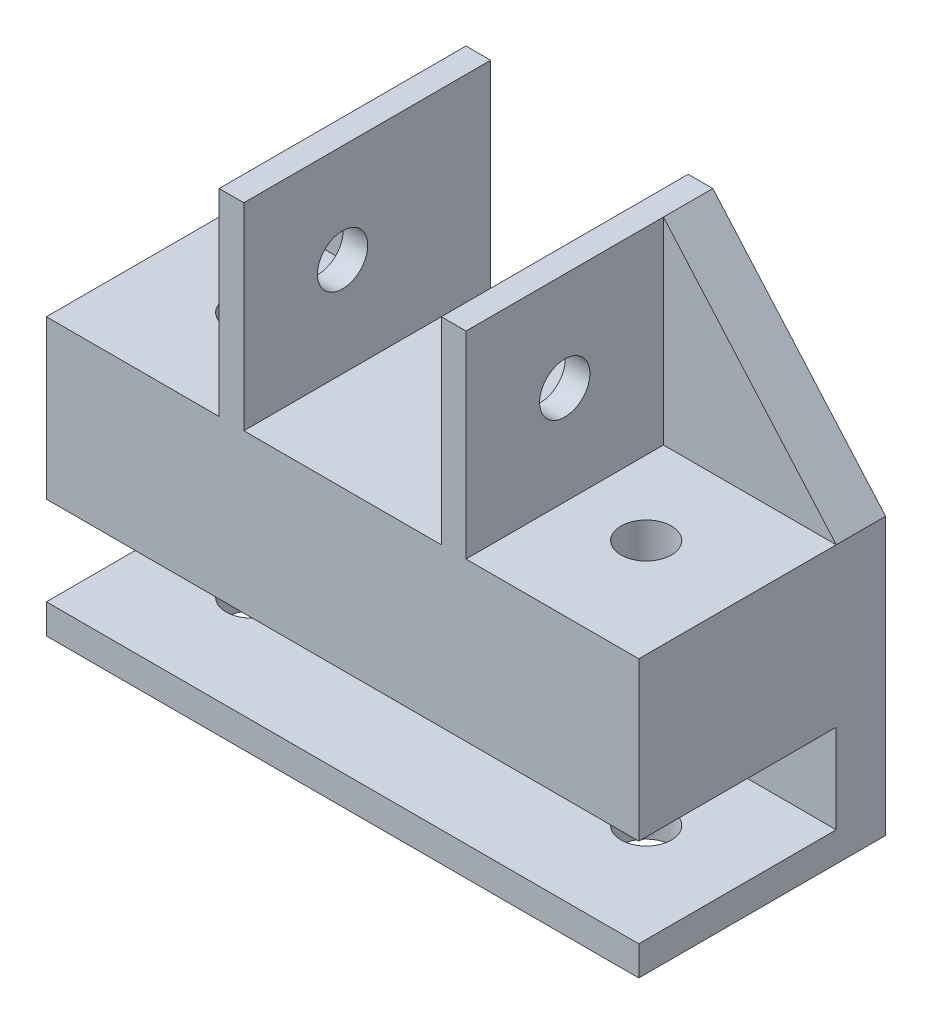
ISO-10303-21;
HEADER;
FILE_DESCRIPTION(('STEP AP214'),'2;1');
FILE_NAME('part.step','',(''),(''),'','','');
FILE_SCHEMA(('AUTOMOTIVE_DESIGN { 1 0 10303 214 1 1 1 1 }'));
ENDSEC;
DATA;
#1=APPLICATION_CONTEXT('core data for automotive mechanical design processes');
#2=APPLICATION_PROTOCOL_DEFINITION('international standard','automotive_design',2000,#1);
#3=PRODUCT_CONTEXT('',#1,'mechanical');
#4=PRODUCT('Part','Part','',(#3));
#5=PRODUCT_RELATED_PRODUCT_CATEGORY('part','',(#4));
#6=PRODUCT_DEFINITION_FORMATION('','',#4);
#7=PRODUCT_DEFINITION_CONTEXT('part definition',#1,'design');
#8=PRODUCT_DEFINITION('design','',#6,#7);
#9=PRODUCT_DEFINITION_SHAPE('','',#8);
#10=(LENGTH_UNIT() NAMED_UNIT(*) SI_UNIT(.MILLI.,.METRE.));
#11=(NAMED_UNIT(*) PLANE_ANGLE_UNIT() SI_UNIT($,.RADIAN.));
#12=(NAMED_UNIT(*) SI_UNIT($,.STERADIAN.) SOLID_ANGLE_UNIT());
#13=UNCERTAINTY_MEASURE_WITH_UNIT(LENGTH_MEASURE(1.E-05),#10,'distance_accuracy_value','');
#14=(GEOMETRIC_REPRESENTATION_CONTEXT(3) GLOBAL_UNCERTAINTY_ASSIGNED_CONTEXT((#13)) GLOBAL_UNIT_ASSIGNED_CONTEXT((#10,
#11,#12)) REPRESENTATION_CONTEXT('',''));
#15=CARTESIAN_POINT('',(0.,0.,0.));
#16=DIRECTION('',(0.,0.,1.));
#17=DIRECTION('',(1.,0.,0.));
#18=AXIS2_PLACEMENT_3D('',#15,#16,#17);
#19=CARTESIAN_POINT('',(0.,0.,-25.));
#20=DIRECTION('',(0.752576694706878,-0.658504607868518,0.));
#21=DIRECTION('',(0.658504607868518,0.752576694706878,0.));
#22=AXIS2_PLACEMENT_3D('',#19,#20,#21);
#23=PLANE('',#22);
#24=DIRECTION('',(-0.658504607868518,-0.752576694706878,0.));
#25=VECTOR('',#24,1.);
#26=CARTESIAN_POINT('',(0.,0.,-20.));
#27=LINE('',#26,#25);
#28=CARTESIAN_POINT('',(17.5,20.,-20.));
#29=VERTEX_POINT('',#28);
#30=CARTESIAN_POINT('',(0.,0.,-20.));
#31=VERTEX_POINT('',#30);
#32=EDGE_CURVE('E11',#29,#31,#27,.T.);
#33=ORIENTED_EDGE('',*,*,#32,.F.);
#34=DIRECTION('',(0.,0.,1.));
#35=VECTOR('',#34,1.);
#36=CARTESIAN_POINT('',(17.5,20.,-25.));
#37=LINE('',#36,#35);
#38=CARTESIAN_POINT('',(17.5,20.,-25.));
#39=VERTEX_POINT('',#38);
#40=EDGE_CURVE('E228',#39,#29,#37,.T.);
#41=ORIENTED_EDGE('',*,*,#40,.F.);
#42=DIRECTION('',(0.658504607868518,0.752576694706878,0.));
#43=VECTOR('',#42,1.);
#44=CARTESIAN_POINT('',(0.,0.,-25.));
#45=LINE('',#44,#43);
#46=CARTESIAN_POINT('',(0.,0.,-25.));
#47=VERTEX_POINT('',#46);
#48=EDGE_CURVE('E223',#47,#39,#45,.T.);
#49=ORIENTED_EDGE('',*,*,#48,.F.);
#50=DIRECTION('',(0.,0.,1.));
#51=VECTOR('',#50,1.);
#52=CARTESIAN_POINT('',(0.,0.,-25.));
#53=LINE('',#52,#51);
#54=EDGE_CURVE('E226',#47,#31,#53,.T.);
#55=ORIENTED_EDGE('',*,*,#54,.T.);
#56=EDGE_LOOP('',(#33,#41,#49,#55));
#57=FACE_BOUND('',#56,.T.);
#58=ADVANCED_FACE('F34',(#57),#23,.F.);
#59=CARTESIAN_POINT('',(0.,20.,0.));
#60=DIRECTION('',(0.,0.,-1.));
#61=DIRECTION('',(-1.,0.,0.));
#62=AXIS2_PLACEMENT_3D('',#59,#60,#61);
#63=PLANE('',#62);
#64=DIRECTION('',(0.,-1.,0.));
#65=VECTOR('',#64,1.);
#66=CARTESIAN_POINT('',(17.5,0.,0.));
#67=LINE('',#66,#65);
#68=CARTESIAN_POINT('',(17.5,20.,0.));
#69=VERTEX_POINT('',#68);
#70=CARTESIAN_POINT('',(17.5,0.,0.));
#71=VERTEX_POINT('',#70);
#72=EDGE_CURVE('E173',#69,#71,#67,.T.);
#73=ORIENTED_EDGE('',*,*,#72,.T.);
#74=DIRECTION('',(-1.,0.,0.));
#75=VECTOR('',#74,1.);
#76=CARTESIAN_POINT('',(17.5,0.,0.));
#77=LINE('',#76,#75);
#78=CARTESIAN_POINT('',(0.,0.,0.));
#79=VERTEX_POINT('',#78);
#80=EDGE_CURVE('E158',#71,#79,#77,.T.);
#81=ORIENTED_EDGE('',*,*,#80,.T.);
#82=DIRECTION('',(0.,-1.,0.));
#83=VECTOR('',#82,1.);
#84=CARTESIAN_POINT('',(0.,20.,0.));
#85=LINE('',#84,#83);
#86=CARTESIAN_POINT('',(0.,-16.,0.));
#87=VERTEX_POINT('',#86);
#88=EDGE_CURVE('E313',#79,#87,#85,.T.);
#89=ORIENTED_EDGE('',*,*,#88,.T.);
#90=DIRECTION('',(-1.,0.,0.));
#91=VECTOR('',#90,1.);
#92=CARTESIAN_POINT('',(0.,-16.,0.));
#93=LINE('',#92,#91);
#94=CARTESIAN_POINT('',(60.,-16.,0.));
#95=VERTEX_POINT('',#94);
#96=EDGE_CURVE('E243',#95,#87,#93,.T.);
#97=ORIENTED_EDGE('',*,*,#96,.F.);
#98=DIRECTION('',(0.,1.,0.));
#99=VECTOR('',#98,1.);
#100=CARTESIAN_POINT('',(60.,-28.,0.));
#101=LINE('',#100,#99);
#102=CARTESIAN_POINT('',(60.,0.,0.));
#103=VERTEX_POINT('',#102);
#104=EDGE_CURVE('E293',#95,#103,#101,.T.);
#105=ORIENTED_EDGE('',*,*,#104,.T.);
#106=DIRECTION('',(1.,0.,0.));
#107=VECTOR('',#106,1.);
#108=CARTESIAN_POINT('',(42.5,0.,0.));
#109=LINE('',#108,#107);
#110=CARTESIAN_POINT('',(42.5,0.,0.));
#111=VERTEX_POINT('',#110);
#112=EDGE_CURVE('E220',#111,#103,#109,.T.);
#113=ORIENTED_EDGE('',*,*,#112,.F.);
#114=DIRECTION('',(0.,-1.,0.));
#115=VECTOR('',#114,1.);
#116=CARTESIAN_POINT('',(42.5,0.,0.));
#117=LINE('',#116,#115);
#118=CARTESIAN_POINT('',(42.5,20.,0.));
#119=VERTEX_POINT('',#118);
#120=EDGE_CURVE('E214',#119,#111,#117,.T.);
#121=ORIENTED_EDGE('',*,*,#120,.F.);
#122=DIRECTION('',(1.,0.,0.));
#123=VECTOR('',#122,1.);
#124=CARTESIAN_POINT('',(0.,20.,0.));
#125=LINE('',#124,#123);
#126=CARTESIAN_POINT('',(40.,20.,0.));
#127=VERTEX_POINT('',#126);
#128=EDGE_CURVE('E264',#127,#119,#125,.T.);
#129=ORIENTED_EDGE('',*,*,#128,.F.);
#130=DIRECTION('',(0.,-1.,0.));
#131=VECTOR('',#130,1.);
#132=CARTESIAN_POINT('',(40.,20.,0.));
#133=LINE('',#132,#131);
#134=CARTESIAN_POINT('',(40.,0.,0.));
#135=VERTEX_POINT('',#134);
#136=EDGE_CURVE('E273',#127,#135,#133,.T.);
#137=ORIENTED_EDGE('',*,*,#136,.T.);
#138=DIRECTION('',(1.,0.,0.));
#139=VECTOR('',#138,1.);
#140=CARTESIAN_POINT('',(0.,0.,0.));
#141=LINE('',#140,#139);
#142=CARTESIAN_POINT('',(20.,0.,0.));
#143=VERTEX_POINT('',#142);
#144=EDGE_CURVE('E284',#143,#135,#141,.T.);
#145=ORIENTED_EDGE('',*,*,#144,.F.);
#146=DIRECTION('',(0.,-1.,0.));
#147=VECTOR('',#146,1.);
#148=CARTESIAN_POINT('',(20.,20.,0.));
#149=LINE('',#148,#147);
#150=CARTESIAN_POINT('',(20.,20.,0.));
#151=VERTEX_POINT('',#150);
#152=EDGE_CURVE('E320',#151,#143,#149,.T.);
#153=ORIENTED_EDGE('',*,*,#152,.F.);
#154=DIRECTION('',(1.,0.,0.));
#155=VECTOR('',#154,1.);
#156=CARTESIAN_POINT('',(0.,20.,0.));
#157=LINE('',#156,#155);
#158=EDGE_CURVE('E179',#69,#151,#157,.T.);
#159=ORIENTED_EDGE('',*,*,#158,.F.);
#160=EDGE_LOOP('',(#73,#81,#89,#97,#105,#113,#121,#129,#137,#145,#153,#159));
#161=FACE_BOUND('',#160,.T.);
#162=ADVANCED_FACE('F177',(#161),#63,.F.);
#163=CARTESIAN_POINT('',(0.,20.,-25.));
#164=DIRECTION('',(0.,0.,-1.));
#165=DIRECTION('',(-1.,0.,0.));
#166=AXIS2_PLACEMENT_3D('',#163,#164,#165);
#167=PLANE('',#166);
#168=ORIENTED_EDGE('',*,*,#48,.T.);
#169=DIRECTION('',(1.,0.,0.));
#170=VECTOR('',#169,1.);
#171=CARTESIAN_POINT('',(0.,20.,-25.));
#172=LINE('',#171,#170);
#173=CARTESIAN_POINT('',(20.,20.,-25.));
#174=VERTEX_POINT('',#173);
#175=EDGE_CURVE('E308',#39,#174,#172,.T.);
#176=ORIENTED_EDGE('',*,*,#175,.T.);
#177=DIRECTION('',(0.,-1.,0.));
#178=VECTOR('',#177,1.);
#179=CARTESIAN_POINT('',(20.,20.,-25.));
#180=LINE('',#179,#178);
#181=CARTESIAN_POINT('',(20.,0.,-25.));
#182=VERTEX_POINT('',#181);
#183=EDGE_CURVE('E317',#174,#182,#180,.T.);
#184=ORIENTED_EDGE('',*,*,#183,.T.);
#185=DIRECTION('',(1.,0.,0.));
#186=VECTOR('',#185,1.);
#187=CARTESIAN_POINT('',(0.,0.,-25.));
#188=LINE('',#187,#186);
#189=CARTESIAN_POINT('',(40.,0.,-25.));
#190=VERTEX_POINT('',#189);
#191=EDGE_CURVE('E280',#182,#190,#188,.T.);
#192=ORIENTED_EDGE('',*,*,#191,.T.);
#193=DIRECTION('',(0.,-1.,0.));
#194=VECTOR('',#193,1.);
#195=CARTESIAN_POINT('',(40.,20.,-25.));
#196=LINE('',#195,#194);
#197=CARTESIAN_POINT('',(40.,20.,-25.));
#198=VERTEX_POINT('',#197);
#199=EDGE_CURVE('E277',#198,#190,#196,.T.);
#200=ORIENTED_EDGE('',*,*,#199,.F.);
#201=DIRECTION('',(1.,0.,0.));
#202=VECTOR('',#201,1.);
#203=CARTESIAN_POINT('',(0.,20.,-25.));
#204=LINE('',#203,#202);
#205=CARTESIAN_POINT('',(42.5,20.,-25.));
#206=VERTEX_POINT('',#205);
#207=EDGE_CURVE('E267',#198,#206,#204,.T.);
#208=ORIENTED_EDGE('',*,*,#207,.T.);
#209=DIRECTION('',(-0.658504607868518,0.752576694706878,0.));
#210=VECTOR('',#209,1.);
#211=CARTESIAN_POINT('',(33.9823008849557,29.7345132743363,-25.));
#212=LINE('',#211,#210);
#213=CARTESIAN_POINT('',(60.,0.,-25.));
#214=VERTEX_POINT('',#213);
#215=EDGE_CURVE('E57',#214,#206,#212,.T.);
#216=ORIENTED_EDGE('',*,*,#215,.F.);
#217=DIRECTION('',(0.,1.,0.));
#218=VECTOR('',#217,1.);
#219=CARTESIAN_POINT('',(60.,-28.,-25.));
#220=LINE('',#219,#218);
#221=CARTESIAN_POINT('',(60.,-28.,-25.));
#222=VERTEX_POINT('',#221);
#223=EDGE_CURVE('E297',#222,#214,#220,.T.);
#224=ORIENTED_EDGE('',*,*,#223,.F.);
#225=DIRECTION('',(1.,0.,0.));
#226=VECTOR('',#225,1.);
#227=CARTESIAN_POINT('',(0.,-28.,-25.));
#228=LINE('',#227,#226);
#229=CARTESIAN_POINT('',(0.,-28.,-25.));
#230=VERTEX_POINT('',#229);
#231=EDGE_CURVE('E281',#230,#222,#228,.T.);
#232=ORIENTED_EDGE('',*,*,#231,.F.);
#233=DIRECTION('',(0.,-1.,0.));
#234=VECTOR('',#233,1.);
#235=CARTESIAN_POINT('',(0.,20.,-25.));
#236=LINE('',#235,#234);
#237=EDGE_CURVE('E315',#47,#230,#236,.T.);
#238=ORIENTED_EDGE('',*,*,#237,.F.);
#239=EDGE_LOOP('',(#168,#176,#184,#192,#200,#208,#216,#224,#232,#238));
#240=FACE_BOUND('',#239,.T.);
#241=ADVANCED_FACE('F350',(#240),#167,.T.);
#242=CARTESIAN_POINT('',(60.,-28.,0.));
#243=DIRECTION('',(1.,0.,0.));
#244=DIRECTION('',(0.,0.,-1.));
#245=AXIS2_PLACEMENT_3D('',#242,#243,#244);
#246=PLANE('',#245);
#247=ORIENTED_EDGE('',*,*,#223,.T.);
#248=DIRECTION('',(0.,0.,1.));
#249=VECTOR('',#248,1.);
#250=CARTESIAN_POINT('',(60.,0.,-25.));
#251=LINE('',#250,#249);
#252=CARTESIAN_POINT('',(60.,0.,-20.));
#253=VERTEX_POINT('',#252);
#254=EDGE_CURVE('E235',#214,#253,#251,.T.);
#255=ORIENTED_EDGE('',*,*,#254,.T.);
#256=DIRECTION('',(0.,0.,1.));
#257=VECTOR('',#256,1.);
#258=CARTESIAN_POINT('',(60.,0.,0.));
#259=LINE('',#258,#257);
#260=EDGE_CURVE('E205',#253,#103,#259,.T.);
#261=ORIENTED_EDGE('',*,*,#260,.T.);
#262=ORIENTED_EDGE('',*,*,#104,.F.);
#263=DIRECTION('',(0.,0.,1.));
#264=VECTOR('',#263,1.);
#265=CARTESIAN_POINT('',(60.,-16.,-20.));
#266=LINE('',#265,#264);
#267=CARTESIAN_POINT('',(60.,-16.,-20.));
#268=VERTEX_POINT('',#267);
#269=EDGE_CURVE('E258',#268,#95,#266,.T.);
#270=ORIENTED_EDGE('',*,*,#269,.F.);
#271=DIRECTION('',(0.,1.,0.));
#272=VECTOR('',#271,1.);
#273=CARTESIAN_POINT('',(60.,-25.,-20.));
#274=LINE('',#273,#272);
#275=CARTESIAN_POINT('',(60.,-25.,-20.));
#276=VERTEX_POINT('',#275);
#277=EDGE_CURVE('E245',#276,#268,#274,.T.);
#278=ORIENTED_EDGE('',*,*,#277,.F.);
#279=DIRECTION('',(0.,0.,1.));
#280=VECTOR('',#279,1.);
#281=CARTESIAN_POINT('',(60.,-25.,-20.));
#282=LINE('',#281,#280);
#283=CARTESIAN_POINT('',(60.,-25.,0.));
#284=VERTEX_POINT('',#283);
#285=EDGE_CURVE('E260',#276,#284,#282,.T.);
#286=ORIENTED_EDGE('',*,*,#285,.T.);
#287=CARTESIAN_POINT('',(60.,-28.,0.));
#288=VERTEX_POINT('',#287);
#289=EDGE_CURVE('E301',#288,#284,#101,.T.);
#290=ORIENTED_EDGE('',*,*,#289,.F.);
#291=DIRECTION('',(0.,0.,-1.));
#292=VECTOR('',#291,1.);
#293=CARTESIAN_POINT('',(60.,-28.,0.));
#294=LINE('',#293,#292);
#295=EDGE_CURVE('E290',#288,#222,#294,.T.);
#296=ORIENTED_EDGE('',*,*,#295,.T.);
#297=EDGE_LOOP('',(#247,#255,#261,#262,#270,#278,#286,#290,#296));
#298=FACE_BOUND('',#297,.T.);
#299=ADVANCED_FACE('F345',(#298),#246,.T.);
#300=CARTESIAN_POINT('',(0.,20.,0.));
#301=DIRECTION('',(0.,1.,0.));
#302=DIRECTION('',(0.,0.,1.));
#303=AXIS2_PLACEMENT_3D('',#300,#301,#302);
#304=PLANE('',#303);
#305=ORIENTED_EDGE('',*,*,#128,.T.);
#306=DIRECTION('',(0.,0.,-1.));
#307=VECTOR('',#306,1.);
#308=CARTESIAN_POINT('',(42.5,20.,0.));
#309=LINE('',#308,#307);
#310=CARTESIAN_POINT('',(42.5,20.,-20.));
#311=VERTEX_POINT('',#310);
#312=EDGE_CURVE('E211',#119,#311,#309,.T.);
#313=ORIENTED_EDGE('',*,*,#312,.T.);
#314=DIRECTION('',(0.,0.,1.));
#315=VECTOR('',#314,1.);
#316=CARTESIAN_POINT('',(42.5,20.,-25.));
#317=LINE('',#316,#315);
#318=EDGE_CURVE('E227',#206,#311,#317,.T.);
#319=ORIENTED_EDGE('',*,*,#318,.F.);
#320=ORIENTED_EDGE('',*,*,#207,.F.);
#321=DIRECTION('',(0.,0.,-1.));
#322=VECTOR('',#321,1.);
#323=CARTESIAN_POINT('',(40.,20.,0.));
#324=LINE('',#323,#322);
#325=EDGE_CURVE('E270',#127,#198,#324,.T.);
#326=ORIENTED_EDGE('',*,*,#325,.F.);
#327=EDGE_LOOP('',(#305,#313,#319,#320,#326));
#328=FACE_BOUND('',#327,.T.);
#329=ADVANCED_FACE('F355',(#328),#304,.T.);
#330=ORIENTED_EDGE('',*,*,#289,.T.);
#331=DIRECTION('',(1.,0.,0.));
#332=VECTOR('',#331,1.);
#333=CARTESIAN_POINT('',(0.,-25.,0.));
#334=LINE('',#333,#332);
#335=CARTESIAN_POINT('',(0.,-25.,0.));
#336=VERTEX_POINT('',#335);
#337=EDGE_CURVE('E231',#336,#284,#334,.T.);
#338=ORIENTED_EDGE('',*,*,#337,.F.);
#339=CARTESIAN_POINT('',(0.,-28.,0.));
#340=VERTEX_POINT('',#339);
#341=EDGE_CURVE('E310',#336,#340,#85,.T.);
#342=ORIENTED_EDGE('',*,*,#341,.T.);
#343=DIRECTION('',(1.,0.,0.));
#344=VECTOR('',#343,1.);
#345=CARTESIAN_POINT('',(0.,-28.,0.));
#346=LINE('',#345,#344);
#347=EDGE_CURVE('E287',#340,#288,#346,.T.);
#348=ORIENTED_EDGE('',*,*,#347,.T.);
#349=EDGE_LOOP('',(#330,#338,#342,#348));
#350=FACE_BOUND('',#349,.T.);
#351=ADVANCED_FACE('F36',(#350),#63,.F.);
#352=CARTESIAN_POINT('',(20.,20.,0.));
#353=DIRECTION('',(-1.,0.,0.));
#354=DIRECTION('',(0.,0.,1.));
#355=AXIS2_PLACEMENT_3D('',#352,#353,#354);
#356=PLANE('',#355);
#357=CARTESIAN_POINT('',(20.,10.,-10.));
#358=DIRECTION('',(-1.,0.,0.));
#359=DIRECTION('',(0.,0.,1.));
#360=AXIS2_PLACEMENT_3D('',#357,#358,#359);
#361=CIRCLE('',#360,2.55);
#362=CARTESIAN_POINT('',(20.,10.,-7.45));
#363=VERTEX_POINT('',#362);
#364=EDGE_CURVE('E187',#363,#363,#361,.F.);
#365=ORIENTED_EDGE('',*,*,#364,.F.);
#366=EDGE_LOOP('',(#365));
#367=FACE_BOUND('',#366,.T.);
#368=DIRECTION('',(0.,0.,-1.));
#369=VECTOR('',#368,1.);
#370=CARTESIAN_POINT('',(20.,0.,0.));
#371=LINE('',#370,#369);
#372=EDGE_CURVE('E300',#143,#182,#371,.T.);
#373=ORIENTED_EDGE('',*,*,#372,.T.);
#374=ORIENTED_EDGE('',*,*,#183,.F.);
#375=DIRECTION('',(0.,0.,-1.));
#376=VECTOR('',#375,1.);
#377=CARTESIAN_POINT('',(20.,20.,0.));
#378=LINE('',#377,#376);
#379=EDGE_CURVE('E305',#151,#174,#378,.T.);
#380=ORIENTED_EDGE('',*,*,#379,.F.);
#381=ORIENTED_EDGE('',*,*,#152,.T.);
#382=EDGE_LOOP('',(#373,#374,#380,#381));
#383=FACE_BOUND('',#382,.T.);
#384=ADVANCED_FACE('F416',(#367,#383),#356,.F.);
#385=CARTESIAN_POINT('',(0.,20.,0.));
#386=DIRECTION('',(-1.,0.,0.));
#387=DIRECTION('',(0.,0.,1.));
#388=AXIS2_PLACEMENT_3D('',#385,#386,#387);
#389=PLANE('',#388);
#390=ORIENTED_EDGE('',*,*,#54,.F.);
#391=ORIENTED_EDGE('',*,*,#237,.T.);
#392=DIRECTION('',(0.,0.,-1.));
#393=VECTOR('',#392,1.);
#394=CARTESIAN_POINT('',(0.,-28.,0.));
#395=LINE('',#394,#393);
#396=EDGE_CURVE('E283',#340,#230,#395,.T.);
#397=ORIENTED_EDGE('',*,*,#396,.F.);
#398=ORIENTED_EDGE('',*,*,#341,.F.);
#399=DIRECTION('',(0.,0.,1.));
#400=VECTOR('',#399,1.);
#401=CARTESIAN_POINT('',(0.,-25.,-20.));
#402=LINE('',#401,#400);
#403=CARTESIAN_POINT('',(0.,-25.,-20.));
#404=VERTEX_POINT('',#403);
#405=EDGE_CURVE('E250',#404,#336,#402,.T.);
#406=ORIENTED_EDGE('',*,*,#405,.F.);
#407=DIRECTION('',(0.,-1.,0.));
#408=VECTOR('',#407,1.);
#409=CARTESIAN_POINT('',(0.,-25.,-20.));
#410=LINE('',#409,#408);
#411=CARTESIAN_POINT('',(0.,-16.,-20.));
#412=VERTEX_POINT('',#411);
#413=EDGE_CURVE('E239',#412,#404,#410,.T.);
#414=ORIENTED_EDGE('',*,*,#413,.F.);
#415=DIRECTION('',(0.,0.,1.));
#416=VECTOR('',#415,1.);
#417=CARTESIAN_POINT('',(0.,-16.,-20.));
#418=LINE('',#417,#416);
#419=EDGE_CURVE('E254',#412,#87,#418,.T.);
#420=ORIENTED_EDGE('',*,*,#419,.T.);
#421=ORIENTED_EDGE('',*,*,#88,.F.);
#422=DIRECTION('',(0.,0.,1.));
#423=VECTOR('',#422,1.);
#424=CARTESIAN_POINT('',(0.,0.,0.));
#425=LINE('',#424,#423);
#426=EDGE_CURVE('E163',#31,#79,#425,.T.);
#427=ORIENTED_EDGE('',*,*,#426,.F.);
#428=EDGE_LOOP('',(#390,#391,#397,#398,#406,#414,#420,#421,#427));
#429=FACE_BOUND('',#428,.T.);
#430=ADVANCED_FACE('F412',(#429),#389,.T.);
#431=CARTESIAN_POINT('',(0.,20.,0.));
#432=DIRECTION('',(0.,1.,0.));
#433=DIRECTION('',(0.,0.,1.));
#434=AXIS2_PLACEMENT_3D('',#431,#432,#433);
#435=PLANE('',#434);
#436=ORIENTED_EDGE('',*,*,#40,.T.);
#437=DIRECTION('',(0.,0.,-1.));
#438=VECTOR('',#437,1.);
#439=CARTESIAN_POINT('',(17.5,20.,0.));
#440=LINE('',#439,#438);
#441=EDGE_CURVE('E180',#69,#29,#440,.T.);
#442=ORIENTED_EDGE('',*,*,#441,.F.);
#443=ORIENTED_EDGE('',*,*,#158,.T.);
#444=ORIENTED_EDGE('',*,*,#379,.T.);
#445=ORIENTED_EDGE('',*,*,#175,.F.);
#446=EDGE_LOOP('',(#436,#442,#443,#444,#445));
#447=FACE_BOUND('',#446,.T.);
#448=ADVANCED_FACE('F406',(#447),#435,.T.);
#449=CARTESIAN_POINT('',(0.,0.,0.));
#450=DIRECTION('',(0.,1.,0.));
#451=DIRECTION('',(0.,0.,1.));
#452=AXIS2_PLACEMENT_3D('',#449,#450,#451);
#453=PLANE('',#452);
#454=DIRECTION('',(0.,0.,-1.));
#455=VECTOR('',#454,1.);
#456=CARTESIAN_POINT('',(40.,0.,0.));
#457=LINE('',#456,#455);
#458=EDGE_CURVE('E257',#135,#190,#457,.T.);
#459=ORIENTED_EDGE('',*,*,#458,.T.);
#460=ORIENTED_EDGE('',*,*,#191,.F.);
#461=ORIENTED_EDGE('',*,*,#372,.F.);
#462=ORIENTED_EDGE('',*,*,#144,.T.);
#463=EDGE_LOOP('',(#459,#460,#461,#462));
#464=FACE_BOUND('',#463,.T.);
#465=ADVANCED_FACE('F402',(#464),#453,.T.);
#466=CARTESIAN_POINT('',(0.,-28.,0.));
#467=DIRECTION('',(0.,1.,0.));
#468=DIRECTION('',(0.,0.,1.));
#469=AXIS2_PLACEMENT_3D('',#466,#467,#468);
#470=PLANE('',#469);
#471=CARTESIAN_POINT('',(10.,-28.,-10.75));
#472=DIRECTION('',(0.,-1.,0.));
#473=DIRECTION('',(0.,0.,1.));
#474=AXIS2_PLACEMENT_3D('',#471,#472,#473);
#475=CIRCLE('',#474,2.55);
#476=CARTESIAN_POINT('',(10.,-28.,-8.2));
#477=VERTEX_POINT('',#476);
#478=EDGE_CURVE('E590',#477,#477,#475,.T.);
#479=ORIENTED_EDGE('',*,*,#478,.F.);
#480=EDGE_LOOP('',(#479));
#481=FACE_BOUND('',#480,.T.);
#482=CARTESIAN_POINT('',(50.,-28.,-10.75));
#483=DIRECTION('',(0.,1.,0.));
#484=DIRECTION('',(0.,0.,1.));
#485=AXIS2_PLACEMENT_3D('',#482,#483,#484);
#486=CIRCLE('',#485,2.55);
#487=CARTESIAN_POINT('',(50.,-28.,-8.2));
#488=VERTEX_POINT('',#487);
#489=EDGE_CURVE('E188',#488,#488,#486,.T.);
#490=ORIENTED_EDGE('',*,*,#489,.T.);
#491=EDGE_LOOP('',(#490));
#492=FACE_BOUND('',#491,.T.);
#493=ORIENTED_EDGE('',*,*,#231,.T.);
#494=ORIENTED_EDGE('',*,*,#295,.F.);
#495=ORIENTED_EDGE('',*,*,#347,.F.);
#496=ORIENTED_EDGE('',*,*,#396,.T.);
#497=EDGE_LOOP('',(#493,#494,#495,#496));
#498=FACE_BOUND('',#497,.T.);
#499=ADVANCED_FACE('F398',(#481,#492,#498),#470,.F.);
#500=CARTESIAN_POINT('',(40.,20.,0.));
#501=DIRECTION('',(-1.,0.,0.));
#502=DIRECTION('',(0.,0.,1.));
#503=AXIS2_PLACEMENT_3D('',#500,#501,#502);
#504=PLANE('',#503);
#505=CARTESIAN_POINT('',(40.,10.,-10.));
#506=DIRECTION('',(-1.,0.,0.));
#507=DIRECTION('',(0.,0.,1.));
#508=AXIS2_PLACEMENT_3D('',#505,#506,#507);
#509=CIRCLE('',#508,2.55);
#510=CARTESIAN_POINT('',(40.,10.,-7.45));
#511=VERTEX_POINT('',#510);
#512=EDGE_CURVE('E202',#511,#511,#509,.F.);
#513=ORIENTED_EDGE('',*,*,#512,.T.);
#514=EDGE_LOOP('',(#513));
#515=FACE_BOUND('',#514,.T.);
#516=ORIENTED_EDGE('',*,*,#458,.F.);
#517=ORIENTED_EDGE('',*,*,#136,.F.);
#518=ORIENTED_EDGE('',*,*,#325,.T.);
#519=ORIENTED_EDGE('',*,*,#199,.T.);
#520=EDGE_LOOP('',(#516,#517,#518,#519));
#521=FACE_BOUND('',#520,.T.);
#522=ADVANCED_FACE('F358',(#515,#521),#504,.T.);
#523=CARTESIAN_POINT('',(0.,-16.,-20.));
#524=DIRECTION('',(0.,1.,0.));
#525=DIRECTION('',(0.,0.,1.));
#526=AXIS2_PLACEMENT_3D('',#523,#524,#525);
#527=PLANE('',#526);
#528=CARTESIAN_POINT('',(10.,-16.,-10.75));
#529=DIRECTION('',(0.,1.,0.));
#530=DIRECTION('',(0.,0.,1.));
#531=AXIS2_PLACEMENT_3D('',#528,#529,#530);
#532=CIRCLE('',#531,2.55);
#533=CARTESIAN_POINT('',(10.,-16.,-8.2));
#534=VERTEX_POINT('',#533);
#535=EDGE_CURVE('E594',#534,#534,#532,.F.);
#536=ORIENTED_EDGE('',*,*,#535,.F.);
#537=EDGE_LOOP('',(#536));
#538=FACE_BOUND('',#537,.T.);
#539=CARTESIAN_POINT('',(50.,-16.,-10.75));
#540=DIRECTION('',(0.,1.,0.));
#541=DIRECTION('',(0.,0.,1.));
#542=AXIS2_PLACEMENT_3D('',#539,#540,#541);
#543=CIRCLE('',#542,2.55);
#544=CARTESIAN_POINT('',(50.,-16.,-8.2));
#545=VERTEX_POINT('',#544);
#546=EDGE_CURVE('E196',#545,#545,#543,.T.);
#547=ORIENTED_EDGE('',*,*,#546,.T.);
#548=EDGE_LOOP('',(#547));
#549=FACE_BOUND('',#548,.T.);
#550=ORIENTED_EDGE('',*,*,#96,.T.);
#551=ORIENTED_EDGE('',*,*,#419,.F.);
#552=DIRECTION('',(-1.,0.,0.));
#553=VECTOR('',#552,1.);
#554=CARTESIAN_POINT('',(0.,-16.,-20.));
#555=LINE('',#554,#553);
#556=EDGE_CURVE('E247',#268,#412,#555,.T.);
#557=ORIENTED_EDGE('',*,*,#556,.F.);
#558=ORIENTED_EDGE('',*,*,#269,.T.);
#559=EDGE_LOOP('',(#550,#551,#557,#558));
#560=FACE_BOUND('',#559,.T.);
#561=ADVANCED_FACE('F387',(#538,#549,#560),#527,.F.);
#562=CARTESIAN_POINT('',(0.,-25.,-20.));
#563=DIRECTION('',(0.,-1.,0.));
#564=DIRECTION('',(1.,0.,0.));
#565=AXIS2_PLACEMENT_3D('',#562,#563,#564);
#566=PLANE('',#565);
#567=CARTESIAN_POINT('',(10.,-25.,-10.75));
#568=DIRECTION('',(0.,-1.,0.));
#569=DIRECTION('',(1.,0.,0.));
#570=AXIS2_PLACEMENT_3D('',#567,#568,#569);
#571=CIRCLE('',#570,2.55);
#572=CARTESIAN_POINT('',(12.55,-25.,-10.75));
#573=VERTEX_POINT('',#572);
#574=EDGE_CURVE('E593',#573,#573,#571,.F.);
#575=ORIENTED_EDGE('',*,*,#574,.F.);
#576=EDGE_LOOP('',(#575));
#577=FACE_BOUND('',#576,.T.);
#578=CARTESIAN_POINT('',(50.,-25.,-10.75));
#579=DIRECTION('',(0.,-1.,0.));
#580=DIRECTION('',(1.,0.,0.));
#581=AXIS2_PLACEMENT_3D('',#578,#579,#580);
#582=CIRCLE('',#581,2.55);
#583=CARTESIAN_POINT('',(52.55,-25.,-10.75));
#584=VERTEX_POINT('',#583);
#585=EDGE_CURVE('E193',#584,#584,#582,.T.);
#586=ORIENTED_EDGE('',*,*,#585,.T.);
#587=EDGE_LOOP('',(#586));
#588=FACE_BOUND('',#587,.T.);
#589=ORIENTED_EDGE('',*,*,#337,.T.);
#590=ORIENTED_EDGE('',*,*,#285,.F.);
#591=DIRECTION('',(1.,0.,0.));
#592=VECTOR('',#591,1.);
#593=CARTESIAN_POINT('',(0.,-25.,-20.));
#594=LINE('',#593,#592);
#595=EDGE_CURVE('E242',#404,#276,#594,.T.);
#596=ORIENTED_EDGE('',*,*,#595,.F.);
#597=ORIENTED_EDGE('',*,*,#405,.T.);
#598=EDGE_LOOP('',(#589,#590,#596,#597));
#599=FACE_BOUND('',#598,.T.);
#600=ADVANCED_FACE('F385',(#577,#588,#599),#566,.F.);
#601=CARTESIAN_POINT('',(0.,0.,-20.));
#602=DIRECTION('',(0.,0.,-1.));
#603=DIRECTION('',(-1.,0.,0.));
#604=AXIS2_PLACEMENT_3D('',#601,#602,#603);
#605=PLANE('',#604);
#606=ORIENTED_EDGE('',*,*,#413,.T.);
#607=ORIENTED_EDGE('',*,*,#595,.T.);
#608=ORIENTED_EDGE('',*,*,#277,.T.);
#609=ORIENTED_EDGE('',*,*,#556,.T.);
#610=EDGE_LOOP('',(#606,#607,#608,#609));
#611=FACE_BOUND('',#610,.T.);
#612=ADVANCED_FACE('F382',(#611),#605,.F.);
#613=CARTESIAN_POINT('',(33.9823008849557,29.7345132743363,-25.));
#614=DIRECTION('',(0.752576694706878,0.658504607868518,0.));
#615=DIRECTION('',(-0.658504607868518,0.752576694706878,0.));
#616=AXIS2_PLACEMENT_3D('',#613,#614,#615);
#617=PLANE('',#616);
#618=DIRECTION('',(-0.658504607868518,0.752576694706878,0.));
#619=VECTOR('',#618,1.);
#620=CARTESIAN_POINT('',(33.9823008849557,29.7345132743363,-20.));
#621=LINE('',#620,#619);
#622=EDGE_CURVE('E43',#253,#311,#621,.T.);
#623=ORIENTED_EDGE('',*,*,#622,.F.);
#624=ORIENTED_EDGE('',*,*,#254,.F.);
#625=ORIENTED_EDGE('',*,*,#215,.T.);
#626=ORIENTED_EDGE('',*,*,#318,.T.);
#627=EDGE_LOOP('',(#623,#624,#625,#626));
#628=FACE_BOUND('',#627,.T.);
#629=ADVANCED_FACE('F334',(#628),#617,.T.);
#630=CARTESIAN_POINT('',(42.5,0.,0.));
#631=DIRECTION('',(0.,1.,0.));
#632=DIRECTION('',(0.,0.,1.));
#633=AXIS2_PLACEMENT_3D('',#630,#631,#632);
#634=PLANE('',#633);
#635=CARTESIAN_POINT('',(50.,0.,-10.75));
#636=DIRECTION('',(0.,1.,0.));
#637=DIRECTION('',(0.,0.,1.));
#638=AXIS2_PLACEMENT_3D('',#635,#636,#637);
#639=CIRCLE('',#638,2.55);
#640=CARTESIAN_POINT('',(50.,0.,-8.2));
#641=VERTEX_POINT('',#640);
#642=EDGE_CURVE('E192',#641,#641,#639,.T.);
#643=ORIENTED_EDGE('',*,*,#642,.F.);
#644=EDGE_LOOP('',(#643));
#645=FACE_BOUND('',#644,.T.);
#646=ORIENTED_EDGE('',*,*,#260,.F.);
#647=DIRECTION('',(1.,0.,0.));
#648=VECTOR('',#647,1.);
#649=CARTESIAN_POINT('',(42.5,0.,-20.));
#650=LINE('',#649,#648);
#651=CARTESIAN_POINT('',(42.5,0.,-20.));
#652=VERTEX_POINT('',#651);
#653=EDGE_CURVE('E217',#652,#253,#650,.T.);
#654=ORIENTED_EDGE('',*,*,#653,.F.);
#655=DIRECTION('',(0.,0.,1.));
#656=VECTOR('',#655,1.);
#657=CARTESIAN_POINT('',(42.5,0.,0.));
#658=LINE('',#657,#656);
#659=EDGE_CURVE('E206',#652,#111,#658,.T.);
#660=ORIENTED_EDGE('',*,*,#659,.T.);
#661=ORIENTED_EDGE('',*,*,#112,.T.);
#662=EDGE_LOOP('',(#646,#654,#660,#661));
#663=FACE_BOUND('',#662,.T.);
#664=ADVANCED_FACE('F330',(#645,#663),#634,.T.);
#665=CARTESIAN_POINT('',(42.5,0.,-20.));
#666=DIRECTION('',(0.,0.,-1.));
#667=DIRECTION('',(-1.,0.,0.));
#668=AXIS2_PLACEMENT_3D('',#665,#666,#667);
#669=PLANE('',#668);
#670=ORIENTED_EDGE('',*,*,#622,.T.);
#671=DIRECTION('',(0.,1.,0.));
#672=VECTOR('',#671,1.);
#673=CARTESIAN_POINT('',(42.5,0.,-20.));
#674=LINE('',#673,#672);
#675=EDGE_CURVE('E208',#652,#311,#674,.T.);
#676=ORIENTED_EDGE('',*,*,#675,.F.);
#677=ORIENTED_EDGE('',*,*,#653,.T.);
#678=EDGE_LOOP('',(#670,#676,#677));
#679=FACE_BOUND('',#678,.T.);
#680=ADVANCED_FACE('F333',(#679),#669,.F.);
#681=CARTESIAN_POINT('',(42.5,0.,0.));
#682=DIRECTION('',(1.,0.,0.));
#683=DIRECTION('',(0.,0.,-1.));
#684=AXIS2_PLACEMENT_3D('',#681,#682,#683);
#685=PLANE('',#684);
#686=CARTESIAN_POINT('',(42.5,10.,-10.));
#687=DIRECTION('',(1.,0.,0.));
#688=DIRECTION('',(0.,0.,-1.));
#689=AXIS2_PLACEMENT_3D('',#686,#687,#688);
#690=CIRCLE('',#689,2.55);
#691=CARTESIAN_POINT('',(42.5,10.,-12.55));
#692=VERTEX_POINT('',#691);
#693=EDGE_CURVE('E199',#692,#692,#690,.T.);
#694=ORIENTED_EDGE('',*,*,#693,.F.);
#695=EDGE_LOOP('',(#694));
#696=FACE_BOUND('',#695,.T.);
#697=ORIENTED_EDGE('',*,*,#659,.F.);
#698=ORIENTED_EDGE('',*,*,#675,.T.);
#699=ORIENTED_EDGE('',*,*,#312,.F.);
#700=ORIENTED_EDGE('',*,*,#120,.T.);
#701=EDGE_LOOP('',(#697,#698,#699,#700));
#702=FACE_BOUND('',#701,.T.);
#703=ADVANCED_FACE('F363',(#696,#702),#685,.T.);
#704=CARTESIAN_POINT('',(32.7875108318972,10.,-9.99999999999999));
#705=DIRECTION('',(1.,0.,0.));
#706=DIRECTION('',(0.,0.,-1.));
#707=AXIS2_PLACEMENT_3D('',#704,#705,#706);
#708=CYLINDRICAL_SURFACE('',#707,2.55);
#709=ORIENTED_EDGE('',*,*,#693,.T.);
#710=EDGE_LOOP('',(#709));
#711=FACE_BOUND('',#710,.T.);
#712=ORIENTED_EDGE('',*,*,#512,.F.);
#713=EDGE_LOOP('',(#712));
#714=FACE_BOUND('',#713,.T.);
#715=ADVANCED_FACE('F369',(#711,#714),#708,.F.);
#716=CARTESIAN_POINT('',(50.,-28.,-10.75));
#717=DIRECTION('',(0.,1.,0.));
#718=DIRECTION('',(0.,0.,1.));
#719=AXIS2_PLACEMENT_3D('',#716,#717,#718);
#720=CYLINDRICAL_SURFACE('',#719,2.55);
#721=ORIENTED_EDGE('',*,*,#642,.T.);
#722=EDGE_LOOP('',(#721));
#723=FACE_BOUND('',#722,.T.);
#724=ORIENTED_EDGE('',*,*,#546,.F.);
#725=EDGE_LOOP('',(#724));
#726=FACE_BOUND('',#725,.T.);
#727=ADVANCED_FACE('F327',(#723,#726),#720,.F.);
#728=ORIENTED_EDGE('',*,*,#489,.F.);
#729=EDGE_LOOP('',(#728));
#730=FACE_BOUND('',#729,.T.);
#731=ORIENTED_EDGE('',*,*,#585,.F.);
#732=EDGE_LOOP('',(#731));
#733=FACE_BOUND('',#732,.T.);
#734=ADVANCED_FACE('F449',(#730,#733),#720,.F.);
#735=CARTESIAN_POINT('',(17.5,0.,-20.));
#736=DIRECTION('',(0.,0.,1.));
#737=DIRECTION('',(1.,0.,0.));
#738=AXIS2_PLACEMENT_3D('',#735,#736,#737);
#739=PLANE('',#738);
#740=ORIENTED_EDGE('',*,*,#32,.T.);
#741=DIRECTION('',(-1.,0.,0.));
#742=VECTOR('',#741,1.);
#743=CARTESIAN_POINT('',(17.5,0.,-20.));
#744=LINE('',#743,#742);
#745=CARTESIAN_POINT('',(17.5,0.,-20.));
#746=VERTEX_POINT('',#745);
#747=EDGE_CURVE('E50',#746,#31,#744,.T.);
#748=ORIENTED_EDGE('',*,*,#747,.F.);
#749=DIRECTION('',(0.,1.,0.));
#750=VECTOR('',#749,1.);
#751=CARTESIAN_POINT('',(17.5,0.,-20.));
#752=LINE('',#751,#750);
#753=EDGE_CURVE('E167',#746,#29,#752,.T.);
#754=ORIENTED_EDGE('',*,*,#753,.T.);
#755=EDGE_LOOP('',(#740,#748,#754));
#756=FACE_BOUND('',#755,.T.);
#757=ADVANCED_FACE('F433',(#756),#739,.T.);
#758=CARTESIAN_POINT('',(17.5,0.,0.));
#759=DIRECTION('',(0.,-1.,0.));
#760=DIRECTION('',(0.,0.,-1.));
#761=AXIS2_PLACEMENT_3D('',#758,#759,#760);
#762=PLANE('',#761);
#763=CARTESIAN_POINT('',(10.,0.,-10.75));
#764=DIRECTION('',(0.,-1.,0.));
#765=DIRECTION('',(0.,0.,-1.));
#766=AXIS2_PLACEMENT_3D('',#763,#764,#765);
#767=CIRCLE('',#766,2.55);
#768=CARTESIAN_POINT('',(10.,0.,-13.3));
#769=VERTEX_POINT('',#768);
#770=EDGE_CURVE('E38',#769,#769,#767,.F.);
#771=ORIENTED_EDGE('',*,*,#770,.F.);
#772=EDGE_LOOP('',(#771));
#773=FACE_BOUND('',#772,.T.);
#774=ORIENTED_EDGE('',*,*,#426,.T.);
#775=ORIENTED_EDGE('',*,*,#80,.F.);
#776=DIRECTION('',(0.,0.,1.));
#777=VECTOR('',#776,1.);
#778=CARTESIAN_POINT('',(17.5,0.,0.));
#779=LINE('',#778,#777);
#780=EDGE_CURVE('E161',#746,#71,#779,.T.);
#781=ORIENTED_EDGE('',*,*,#780,.F.);
#782=ORIENTED_EDGE('',*,*,#747,.T.);
#783=EDGE_LOOP('',(#774,#775,#781,#782));
#784=FACE_BOUND('',#783,.T.);
#785=ADVANCED_FACE('F160',(#773,#784),#762,.F.);
#786=CARTESIAN_POINT('',(17.5,0.,0.));
#787=DIRECTION('',(-1.,0.,0.));
#788=DIRECTION('',(0.,0.,-1.));
#789=AXIS2_PLACEMENT_3D('',#786,#787,#788);
#790=PLANE('',#789);
#791=CARTESIAN_POINT('',(17.5,10.,-10.));
#792=DIRECTION('',(1.,0.,0.));
#793=DIRECTION('',(0.,0.,-1.));
#794=AXIS2_PLACEMENT_3D('',#791,#792,#793);
#795=CIRCLE('',#794,2.55);
#796=CARTESIAN_POINT('',(17.5,10.,-12.55));
#797=VERTEX_POINT('',#796);
#798=EDGE_CURVE('E597',#797,#797,#795,.T.);
#799=ORIENTED_EDGE('',*,*,#798,.T.);
#800=EDGE_LOOP('',(#799));
#801=FACE_BOUND('',#800,.T.);
#802=ORIENTED_EDGE('',*,*,#780,.T.);
#803=ORIENTED_EDGE('',*,*,#72,.F.);
#804=ORIENTED_EDGE('',*,*,#441,.T.);
#805=ORIENTED_EDGE('',*,*,#753,.F.);
#806=EDGE_LOOP('',(#802,#803,#804,#805));
#807=FACE_BOUND('',#806,.T.);
#808=ADVANCED_FACE('F171',(#801,#807),#790,.T.);
#809=CARTESIAN_POINT('',(47.2124891681028,10.,-9.99999999999998));
#810=DIRECTION('',(-1.,0.,0.));
#811=DIRECTION('',(0.,0.,1.));
#812=AXIS2_PLACEMENT_3D('',#809,#810,#811);
#813=CYLINDRICAL_SURFACE('',#812,2.55);
#814=ORIENTED_EDGE('',*,*,#798,.F.);
#815=EDGE_LOOP('',(#814));
#816=FACE_BOUND('',#815,.T.);
#817=ORIENTED_EDGE('',*,*,#364,.T.);
#818=EDGE_LOOP('',(#817));
#819=FACE_BOUND('',#818,.T.);
#820=ADVANCED_FACE('F556',(#816,#819),#813,.F.);
#821=CARTESIAN_POINT('',(10.,-28.,-10.75));
#822=DIRECTION('',(0.,1.,0.));
#823=DIRECTION('',(0.,0.,1.));
#824=AXIS2_PLACEMENT_3D('',#821,#822,#823);
#825=CYLINDRICAL_SURFACE('',#824,2.55);
#826=ORIENTED_EDGE('',*,*,#770,.T.);
#827=EDGE_LOOP('',(#826));
#828=FACE_BOUND('',#827,.T.);
#829=ORIENTED_EDGE('',*,*,#535,.T.);
#830=EDGE_LOOP('',(#829));
#831=FACE_BOUND('',#830,.T.);
#832=ADVANCED_FACE('F565',(#828,#831),#825,.F.);
#833=ORIENTED_EDGE('',*,*,#478,.T.);
#834=EDGE_LOOP('',(#833));
#835=FACE_BOUND('',#834,.T.);
#836=ORIENTED_EDGE('',*,*,#574,.T.);
#837=EDGE_LOOP('',(#836));
#838=FACE_BOUND('',#837,.T.);
#839=ADVANCED_FACE('F574',(#835,#838),#825,.F.);
#840=CLOSED_SHELL('',(#58,#162,#241,#299,#329,#351,#384,#430,#448,#465,#499,#522,#561,#600,#612,
#629,#664,#680,#703,#715,#727,#734,#757,#785,#808,#820,#832,#839));
#841=MANIFOLD_SOLID_BREP('B2',#840);
#842=ADVANCED_BREP_SHAPE_REPRESENTATION('',(#18,#841),#14);
#843=SHAPE_DEFINITION_REPRESENTATION(#9,#842);
ENDSEC;
END-ISO-10303-21;
